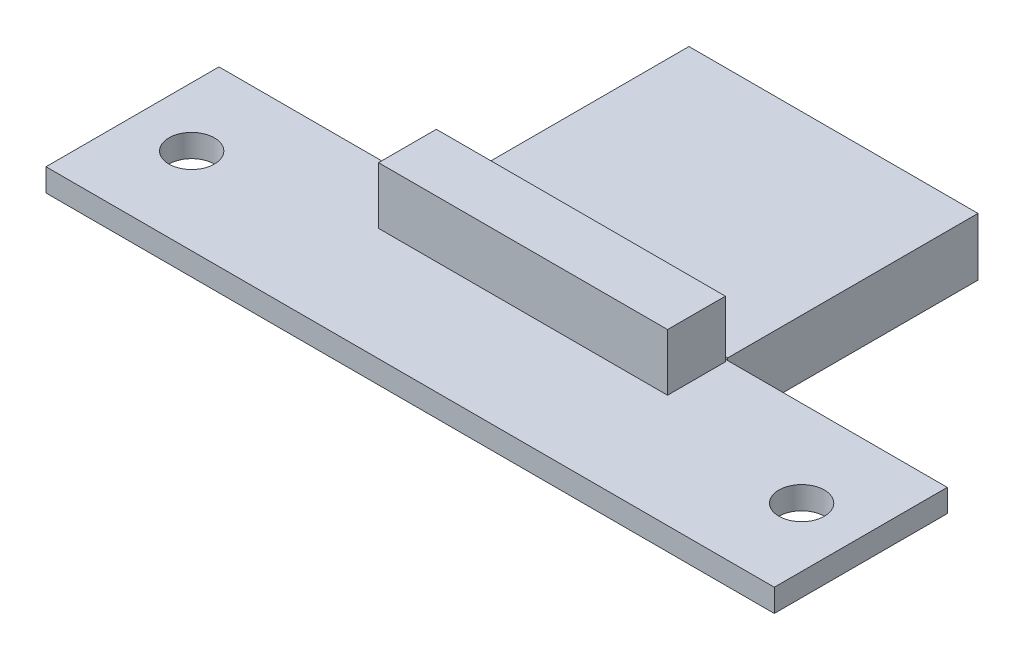
ISO-10303-21;
HEADER;
FILE_DESCRIPTION(('STEP AP214'),'2;1');
FILE_NAME('part.step','',(''),(''),'','','');
FILE_SCHEMA(('AUTOMOTIVE_DESIGN { 1 0 10303 214 1 1 1 1 }'));
ENDSEC;
DATA;
#1=APPLICATION_CONTEXT('core data for automotive mechanical design processes');
#2=APPLICATION_PROTOCOL_DEFINITION('international standard','automotive_design',2000,#1);
#3=PRODUCT_CONTEXT('',#1,'mechanical');
#4=PRODUCT('Part','Part','',(#3));
#5=PRODUCT_RELATED_PRODUCT_CATEGORY('part','',(#4));
#6=PRODUCT_DEFINITION_FORMATION('','',#4);
#7=PRODUCT_DEFINITION_CONTEXT('part definition',#1,'design');
#8=PRODUCT_DEFINITION('design','',#6,#7);
#9=PRODUCT_DEFINITION_SHAPE('','',#8);
#10=(LENGTH_UNIT() NAMED_UNIT(*) SI_UNIT(.MILLI.,.METRE.));
#11=(NAMED_UNIT(*) PLANE_ANGLE_UNIT() SI_UNIT($,.RADIAN.));
#12=(NAMED_UNIT(*) SI_UNIT($,.STERADIAN.) SOLID_ANGLE_UNIT());
#13=UNCERTAINTY_MEASURE_WITH_UNIT(LENGTH_MEASURE(1.E-05),#10,'distance_accuracy_value','');
#14=(GEOMETRIC_REPRESENTATION_CONTEXT(3) GLOBAL_UNCERTAINTY_ASSIGNED_CONTEXT((#13)) GLOBAL_UNIT_ASSIGNED_CONTEXT((#10,
#11,#12)) REPRESENTATION_CONTEXT('',''));
#15=CARTESIAN_POINT('',(0.,0.,0.));
#16=DIRECTION('',(0.,0.,1.));
#17=DIRECTION('',(1.,0.,0.));
#18=AXIS2_PLACEMENT_3D('',#15,#16,#17);
#19=CARTESIAN_POINT('',(0.,1.,0.));
#20=DIRECTION('',(0.,1.,0.));
#21=DIRECTION('',(0.,0.,1.));
#22=AXIS2_PLACEMENT_3D('',#19,#20,#21);
#23=PLANE('',#22);
#24=CARTESIAN_POINT('',(13.4,1.,0.));
#25=DIRECTION('',(0.,1.,0.));
#26=DIRECTION('',(0.,0.,1.));
#27=AXIS2_PLACEMENT_3D('',#24,#25,#26);
#28=CIRCLE('',#27,1.);
#29=CARTESIAN_POINT('',(13.4,1.,0.999999999999997));
#30=VERTEX_POINT('',#29);
#31=EDGE_CURVE('E370',#30,#30,#28,.T.);
#32=ORIENTED_EDGE('',*,*,#31,.F.);
#33=EDGE_LOOP('',(#32));
#34=FACE_BOUND('',#33,.T.);
#35=CARTESIAN_POINT('',(-13.4,1.,0.));
#36=DIRECTION('',(0.,1.,0.));
#37=DIRECTION('',(0.,0.,1.));
#38=AXIS2_PLACEMENT_3D('',#35,#36,#37);
#39=CIRCLE('',#38,1.);
#40=CARTESIAN_POINT('',(-13.4,1.,1.));
#41=VERTEX_POINT('',#40);
#42=EDGE_CURVE('E374',#41,#41,#39,.T.);
#43=ORIENTED_EDGE('',*,*,#42,.F.);
#44=EDGE_LOOP('',(#43));
#45=FACE_BOUND('',#44,.T.);
#46=DIRECTION('',(0.,0.,-1.));
#47=VECTOR('',#46,1.);
#48=CARTESIAN_POINT('',(16.,1.,-3.8));
#49=LINE('',#48,#47);
#50=CARTESIAN_POINT('',(16.,1.,3.8));
#51=VERTEX_POINT('',#50);
#52=CARTESIAN_POINT('',(16.,1.,-3.8));
#53=VERTEX_POINT('',#52);
#54=EDGE_CURVE('E383',#51,#53,#49,.T.);
#55=ORIENTED_EDGE('',*,*,#54,.T.);
#56=DIRECTION('',(-1.,0.,0.));
#57=VECTOR('',#56,1.);
#58=CARTESIAN_POINT('',(-16.,1.,-3.8));
#59=LINE('',#58,#57);
#60=CARTESIAN_POINT('',(6.35,1.,-3.8));
#61=VERTEX_POINT('',#60);
#62=EDGE_CURVE('E387',#53,#61,#59,.T.);
#63=ORIENTED_EDGE('',*,*,#62,.T.);
#64=CARTESIAN_POINT('',(-6.35,1.,-3.8));
#65=VERTEX_POINT('',#64);
#66=EDGE_CURVE('E391',#61,#65,#59,.T.);
#67=ORIENTED_EDGE('',*,*,#66,.T.);
#68=CARTESIAN_POINT('',(-16.,1.,-3.8));
#69=VERTEX_POINT('',#68);
#70=EDGE_CURVE('E62',#65,#69,#59,.T.);
#71=ORIENTED_EDGE('',*,*,#70,.T.);
#72=DIRECTION('',(0.,0.,1.));
#73=VECTOR('',#72,1.);
#74=CARTESIAN_POINT('',(-16.,1.,-3.8));
#75=LINE('',#74,#73);
#76=CARTESIAN_POINT('',(-16.,1.,3.8));
#77=VERTEX_POINT('',#76);
#78=EDGE_CURVE('E390',#69,#77,#75,.T.);
#79=ORIENTED_EDGE('',*,*,#78,.T.);
#80=DIRECTION('',(1.,0.,0.));
#81=VECTOR('',#80,1.);
#82=CARTESIAN_POINT('',(-16.,1.,3.8));
#83=LINE('',#82,#81);
#84=EDGE_CURVE('E393',#77,#51,#83,.T.);
#85=ORIENTED_EDGE('',*,*,#84,.T.);
#86=EDGE_LOOP('',(#55,#63,#67,#71,#79,#85));
#87=FACE_BOUND('',#86,.T.);
#88=DIRECTION('',(-1.,0.,0.));
#89=VECTOR('',#88,1.);
#90=CARTESIAN_POINT('',(-6.35,1.,-3.7));
#91=LINE('',#90,#89);
#92=CARTESIAN_POINT('',(6.35,1.,-3.7));
#93=VERTEX_POINT('',#92);
#94=CARTESIAN_POINT('',(-6.35,1.,-3.7));
#95=VERTEX_POINT('',#94);
#96=EDGE_CURVE('E826',#93,#95,#91,.T.);
#97=ORIENTED_EDGE('',*,*,#96,.F.);
#98=DIRECTION('',(0.,0.,-1.));
#99=VECTOR('',#98,1.);
#100=CARTESIAN_POINT('',(6.35,1.,-1.16));
#101=LINE('',#100,#99);
#102=CARTESIAN_POINT('',(6.35,1.,-1.16));
#103=VERTEX_POINT('',#102);
#104=EDGE_CURVE('E235',#103,#93,#101,.T.);
#105=ORIENTED_EDGE('',*,*,#104,.F.);
#106=DIRECTION('',(1.,0.,0.));
#107=VECTOR('',#106,1.);
#108=CARTESIAN_POINT('',(-6.35,1.,-1.16));
#109=LINE('',#108,#107);
#110=CARTESIAN_POINT('',(-6.35,1.,-1.16));
#111=VERTEX_POINT('',#110);
#112=EDGE_CURVE('E231',#111,#103,#109,.T.);
#113=ORIENTED_EDGE('',*,*,#112,.F.);
#114=DIRECTION('',(0.,0.,1.));
#115=VECTOR('',#114,1.);
#116=CARTESIAN_POINT('',(-6.35,1.,-1.16));
#117=LINE('',#116,#115);
#118=EDGE_CURVE('E823',#95,#111,#117,.T.);
#119=ORIENTED_EDGE('',*,*,#118,.F.);
#120=EDGE_LOOP('',(#97,#105,#113,#119));
#121=FACE_BOUND('',#120,.T.);
#122=ADVANCED_FACE('F35',(#34,#45,#87,#121),#23,.T.);
#123=CARTESIAN_POINT('',(-16.,1.,-3.8));
#124=DIRECTION('',(0.,0.,1.));
#125=DIRECTION('',(1.,0.,0.));
#126=AXIS2_PLACEMENT_3D('',#123,#124,#125);
#127=PLANE('',#126);
#128=DIRECTION('',(0.,1.,0.));
#129=VECTOR('',#128,1.);
#130=CARTESIAN_POINT('',(-6.35,1.1,-3.8));
#131=LINE('',#130,#129);
#132=CARTESIAN_POINT('',(-6.35,0.,-3.8));
#133=VERTEX_POINT('',#132);
#134=EDGE_CURVE('E11',#133,#65,#131,.T.);
#135=ORIENTED_EDGE('',*,*,#134,.F.);
#136=DIRECTION('',(-1.,0.,0.));
#137=VECTOR('',#136,1.);
#138=CARTESIAN_POINT('',(-16.,0.,-3.8));
#139=LINE('',#138,#137);
#140=CARTESIAN_POINT('',(-16.,0.,-3.8));
#141=VERTEX_POINT('',#140);
#142=EDGE_CURVE('E398',#133,#141,#139,.T.);
#143=ORIENTED_EDGE('',*,*,#142,.T.);
#144=DIRECTION('',(0.,-1.,0.));
#145=VECTOR('',#144,1.);
#146=CARTESIAN_POINT('',(-16.,1.,-3.8));
#147=LINE('',#146,#145);
#148=EDGE_CURVE('E409',#69,#141,#147,.T.);
#149=ORIENTED_EDGE('',*,*,#148,.F.);
#150=ORIENTED_EDGE('',*,*,#70,.F.);
#151=EDGE_LOOP('',(#135,#143,#149,#150));
#152=FACE_BOUND('',#151,.T.);
#153=ADVANCED_FACE('F450',(#152),#127,.F.);
#154=DIRECTION('',(0.,-1.,0.));
#155=VECTOR('',#154,1.);
#156=CARTESIAN_POINT('',(6.35,1.1,-3.8));
#157=LINE('',#156,#155);
#158=CARTESIAN_POINT('',(6.35,0.,-3.8));
#159=VERTEX_POINT('',#158);
#160=EDGE_CURVE('E44',#61,#159,#157,.T.);
#161=ORIENTED_EDGE('',*,*,#160,.F.);
#162=ORIENTED_EDGE('',*,*,#62,.F.);
#163=DIRECTION('',(0.,-1.,0.));
#164=VECTOR('',#163,1.);
#165=CARTESIAN_POINT('',(16.,1.,-3.8));
#166=LINE('',#165,#164);
#167=CARTESIAN_POINT('',(16.,0.,-3.8));
#168=VERTEX_POINT('',#167);
#169=EDGE_CURVE('E39',#53,#168,#166,.T.);
#170=ORIENTED_EDGE('',*,*,#169,.T.);
#171=EDGE_CURVE('E399',#168,#159,#139,.T.);
#172=ORIENTED_EDGE('',*,*,#171,.T.);
#173=EDGE_LOOP('',(#161,#162,#170,#172));
#174=FACE_BOUND('',#173,.T.);
#175=ADVANCED_FACE('F464',(#174),#127,.F.);
#176=CARTESIAN_POINT('',(0.,0.,0.));
#177=DIRECTION('',(0.,1.,0.));
#178=DIRECTION('',(0.,0.,1.));
#179=AXIS2_PLACEMENT_3D('',#176,#177,#178);
#180=PLANE('',#179);
#181=DIRECTION('',(0.,0.,1.));
#182=VECTOR('',#181,1.);
#183=CARTESIAN_POINT('',(10.3,0.,1.1));
#184=LINE('',#183,#182);
#185=CARTESIAN_POINT('',(10.3,0.,-1.1));
#186=VERTEX_POINT('',#185);
#187=CARTESIAN_POINT('',(10.3,0.,1.1));
#188=VERTEX_POINT('',#187);
#189=EDGE_CURVE('E304',#186,#188,#184,.T.);
#190=ORIENTED_EDGE('',*,*,#189,.F.);
#191=DIRECTION('',(1.,0.,0.));
#192=VECTOR('',#191,1.);
#193=CARTESIAN_POINT('',(8.7,0.,-1.1));
#194=LINE('',#193,#192);
#195=CARTESIAN_POINT('',(8.7,0.,-1.1));
#196=VERTEX_POINT('',#195);
#197=EDGE_CURVE('E309',#196,#186,#194,.T.);
#198=ORIENTED_EDGE('',*,*,#197,.F.);
#199=DIRECTION('',(0.,0.,-1.));
#200=VECTOR('',#199,1.);
#201=CARTESIAN_POINT('',(8.7,0.,1.1));
#202=LINE('',#201,#200);
#203=CARTESIAN_POINT('',(8.7,0.,1.1));
#204=VERTEX_POINT('',#203);
#205=EDGE_CURVE('E321',#204,#196,#202,.T.);
#206=ORIENTED_EDGE('',*,*,#205,.F.);
#207=DIRECTION('',(-1.,0.,0.));
#208=VECTOR('',#207,1.);
#209=CARTESIAN_POINT('',(8.7,0.,1.1));
#210=LINE('',#209,#208);
#211=EDGE_CURVE('E318',#188,#204,#210,.T.);
#212=ORIENTED_EDGE('',*,*,#211,.F.);
#213=EDGE_LOOP('',(#190,#198,#206,#212));
#214=FACE_BOUND('',#213,.T.);
#215=DIRECTION('',(0.,0.,-1.));
#216=VECTOR('',#215,1.);
#217=CARTESIAN_POINT('',(16.,0.,-3.8));
#218=LINE('',#217,#216);
#219=CARTESIAN_POINT('',(16.,0.,3.8));
#220=VERTEX_POINT('',#219);
#221=EDGE_CURVE('E380',#220,#168,#218,.T.);
#222=ORIENTED_EDGE('',*,*,#221,.F.);
#223=DIRECTION('',(1.,0.,0.));
#224=VECTOR('',#223,1.);
#225=CARTESIAN_POINT('',(-16.,0.,3.8));
#226=LINE('',#225,#224);
#227=CARTESIAN_POINT('',(-16.,0.,3.8));
#228=VERTEX_POINT('',#227);
#229=EDGE_CURVE('E386',#228,#220,#226,.T.);
#230=ORIENTED_EDGE('',*,*,#229,.F.);
#231=DIRECTION('',(0.,0.,1.));
#232=VECTOR('',#231,1.);
#233=CARTESIAN_POINT('',(-16.,0.,-3.8));
#234=LINE('',#233,#232);
#235=EDGE_CURVE('E401',#141,#228,#234,.T.);
#236=ORIENTED_EDGE('',*,*,#235,.F.);
#237=ORIENTED_EDGE('',*,*,#142,.F.);
#238=EDGE_CURVE('E402',#159,#133,#139,.T.);
#239=ORIENTED_EDGE('',*,*,#238,.F.);
#240=ORIENTED_EDGE('',*,*,#171,.F.);
#241=EDGE_LOOP('',(#222,#230,#236,#237,#239,#240));
#242=FACE_BOUND('',#241,.T.);
#243=CARTESIAN_POINT('',(-13.4,0.,0.));
#244=DIRECTION('',(0.,1.,0.));
#245=DIRECTION('',(0.,0.,1.));
#246=AXIS2_PLACEMENT_3D('',#243,#244,#245);
#247=CIRCLE('',#246,1.);
#248=CARTESIAN_POINT('',(-13.4,0.,1.));
#249=VERTEX_POINT('',#248);
#250=EDGE_CURVE('E377',#249,#249,#247,.T.);
#251=ORIENTED_EDGE('',*,*,#250,.T.);
#252=EDGE_LOOP('',(#251));
#253=FACE_BOUND('',#252,.T.);
#254=CARTESIAN_POINT('',(13.4,0.,0.));
#255=DIRECTION('',(0.,1.,0.));
#256=DIRECTION('',(0.,0.,1.));
#257=AXIS2_PLACEMENT_3D('',#254,#255,#256);
#258=CIRCLE('',#257,1.);
#259=CARTESIAN_POINT('',(13.4,0.,0.999999999999997));
#260=VERTEX_POINT('',#259);
#261=EDGE_CURVE('E371',#260,#260,#258,.T.);
#262=ORIENTED_EDGE('',*,*,#261,.T.);
#263=EDGE_LOOP('',(#262));
#264=FACE_BOUND('',#263,.T.);
#265=DIRECTION('',(0.,0.,1.));
#266=VECTOR('',#265,1.);
#267=CARTESIAN_POINT('',(-8.7,0.,1.1));
#268=LINE('',#267,#266);
#269=CARTESIAN_POINT('',(-8.7,0.,-1.1));
#270=VERTEX_POINT('',#269);
#271=CARTESIAN_POINT('',(-8.7,0.,1.1));
#272=VERTEX_POINT('',#271);
#273=EDGE_CURVE('E337',#270,#272,#268,.T.);
#274=ORIENTED_EDGE('',*,*,#273,.F.);
#275=DIRECTION('',(1.,0.,0.));
#276=VECTOR('',#275,1.);
#277=CARTESIAN_POINT('',(-10.3,0.,-1.1));
#278=LINE('',#277,#276);
#279=CARTESIAN_POINT('',(-10.3,0.,-1.1));
#280=VERTEX_POINT('',#279);
#281=EDGE_CURVE('E342',#280,#270,#278,.T.);
#282=ORIENTED_EDGE('',*,*,#281,.F.);
#283=DIRECTION('',(0.,0.,-1.));
#284=VECTOR('',#283,1.);
#285=CARTESIAN_POINT('',(-10.3,0.,1.1));
#286=LINE('',#285,#284);
#287=CARTESIAN_POINT('',(-10.3,0.,1.1));
#288=VERTEX_POINT('',#287);
#289=EDGE_CURVE('E354',#288,#280,#286,.T.);
#290=ORIENTED_EDGE('',*,*,#289,.F.);
#291=DIRECTION('',(-1.,0.,0.));
#292=VECTOR('',#291,1.);
#293=CARTESIAN_POINT('',(-10.3,0.,1.1));
#294=LINE('',#293,#292);
#295=EDGE_CURVE('E351',#272,#288,#294,.T.);
#296=ORIENTED_EDGE('',*,*,#295,.F.);
#297=EDGE_LOOP('',(#274,#282,#290,#296));
#298=FACE_BOUND('',#297,.T.);
#299=DIRECTION('',(0.,0.,1.));
#300=VECTOR('',#299,1.);
#301=CARTESIAN_POINT('',(0.8,0.,2.2));
#302=LINE('',#301,#300);
#303=CARTESIAN_POINT('',(0.800000000000001,0.,0.));
#304=VERTEX_POINT('',#303);
#305=CARTESIAN_POINT('',(0.8,0.,2.2));
#306=VERTEX_POINT('',#305);
#307=EDGE_CURVE('E271',#304,#306,#302,.T.);
#308=ORIENTED_EDGE('',*,*,#307,.F.);
#309=DIRECTION('',(1.,0.,0.));
#310=VECTOR('',#309,1.);
#311=CARTESIAN_POINT('',(-0.800000000000001,0.,0.));
#312=LINE('',#311,#310);
#313=CARTESIAN_POINT('',(-0.800000000000001,0.,0.));
#314=VERTEX_POINT('',#313);
#315=EDGE_CURVE('E276',#314,#304,#312,.T.);
#316=ORIENTED_EDGE('',*,*,#315,.F.);
#317=DIRECTION('',(0.,0.,-1.));
#318=VECTOR('',#317,1.);
#319=CARTESIAN_POINT('',(-0.8,0.,2.2));
#320=LINE('',#319,#318);
#321=CARTESIAN_POINT('',(-0.8,0.,2.2));
#322=VERTEX_POINT('',#321);
#323=EDGE_CURVE('E288',#322,#314,#320,.T.);
#324=ORIENTED_EDGE('',*,*,#323,.F.);
#325=DIRECTION('',(-1.,0.,0.));
#326=VECTOR('',#325,1.);
#327=CARTESIAN_POINT('',(-0.8,0.,2.2));
#328=LINE('',#327,#326);
#329=EDGE_CURVE('E285',#306,#322,#328,.T.);
#330=ORIENTED_EDGE('',*,*,#329,.F.);
#331=EDGE_LOOP('',(#308,#316,#324,#330));
#332=FACE_BOUND('',#331,.T.);
#333=ADVANCED_FACE('F462',(#214,#242,#253,#264,#298,#332),#180,.F.);
#334=CARTESIAN_POINT('',(16.,1.,-3.8));
#335=DIRECTION('',(-1.,0.,0.));
#336=DIRECTION('',(0.,0.,1.));
#337=AXIS2_PLACEMENT_3D('',#334,#335,#336);
#338=PLANE('',#337);
#339=ORIENTED_EDGE('',*,*,#221,.T.);
#340=ORIENTED_EDGE('',*,*,#169,.F.);
#341=ORIENTED_EDGE('',*,*,#54,.F.);
#342=DIRECTION('',(0.,-1.,0.));
#343=VECTOR('',#342,1.);
#344=CARTESIAN_POINT('',(16.,1.,3.8));
#345=LINE('',#344,#343);
#346=EDGE_CURVE('E395',#51,#220,#345,.T.);
#347=ORIENTED_EDGE('',*,*,#346,.T.);
#348=EDGE_LOOP('',(#339,#340,#341,#347));
#349=FACE_BOUND('',#348,.T.);
#350=ADVANCED_FACE('F37',(#349),#338,.F.);
#351=CARTESIAN_POINT('',(-16.,1.,-3.8));
#352=DIRECTION('',(1.,0.,0.));
#353=DIRECTION('',(0.,0.,-1.));
#354=AXIS2_PLACEMENT_3D('',#351,#352,#353);
#355=PLANE('',#354);
#356=ORIENTED_EDGE('',*,*,#235,.T.);
#357=DIRECTION('',(0.,-1.,0.));
#358=VECTOR('',#357,1.);
#359=CARTESIAN_POINT('',(-16.,1.,3.8));
#360=LINE('',#359,#358);
#361=EDGE_CURVE('E407',#77,#228,#360,.T.);
#362=ORIENTED_EDGE('',*,*,#361,.F.);
#363=ORIENTED_EDGE('',*,*,#78,.F.);
#364=ORIENTED_EDGE('',*,*,#148,.T.);
#365=EDGE_LOOP('',(#356,#362,#363,#364));
#366=FACE_BOUND('',#365,.T.);
#367=ADVANCED_FACE('F452',(#366),#355,.F.);
#368=CARTESIAN_POINT('',(-16.,1.,3.8));
#369=DIRECTION('',(0.,0.,-1.));
#370=DIRECTION('',(-1.,0.,0.));
#371=AXIS2_PLACEMENT_3D('',#368,#369,#370);
#372=PLANE('',#371);
#373=ORIENTED_EDGE('',*,*,#229,.T.);
#374=ORIENTED_EDGE('',*,*,#346,.F.);
#375=ORIENTED_EDGE('',*,*,#84,.F.);
#376=ORIENTED_EDGE('',*,*,#361,.T.);
#377=EDGE_LOOP('',(#373,#374,#375,#376));
#378=FACE_BOUND('',#377,.T.);
#379=ADVANCED_FACE('F457',(#378),#372,.F.);
#380=CARTESIAN_POINT('',(-13.4,0.,0.));
#381=DIRECTION('',(0.,1.,0.));
#382=DIRECTION('',(0.,0.,1.));
#383=AXIS2_PLACEMENT_3D('',#380,#381,#382);
#384=CYLINDRICAL_SURFACE('',#383,1.);
#385=ORIENTED_EDGE('',*,*,#250,.F.);
#386=EDGE_LOOP('',(#385));
#387=FACE_BOUND('',#386,.T.);
#388=ORIENTED_EDGE('',*,*,#42,.T.);
#389=EDGE_LOOP('',(#388));
#390=FACE_BOUND('',#389,.T.);
#391=ADVANCED_FACE('F481',(#387,#390),#384,.F.);
#392=CARTESIAN_POINT('',(13.4,0.,0.));
#393=DIRECTION('',(0.,1.,0.));
#394=DIRECTION('',(0.,0.,1.));
#395=AXIS2_PLACEMENT_3D('',#392,#393,#394);
#396=CYLINDRICAL_SURFACE('',#395,1.);
#397=ORIENTED_EDGE('',*,*,#261,.F.);
#398=EDGE_LOOP('',(#397));
#399=FACE_BOUND('',#398,.T.);
#400=ORIENTED_EDGE('',*,*,#31,.T.);
#401=EDGE_LOOP('',(#400));
#402=FACE_BOUND('',#401,.T.);
#403=ADVANCED_FACE('F667',(#399,#402),#396,.F.);
#404=CARTESIAN_POINT('',(-8.7,-1.,1.1));
#405=DIRECTION('',(-1.,0.,0.));
#406=DIRECTION('',(0.,0.,1.));
#407=AXIS2_PLACEMENT_3D('',#404,#405,#406);
#408=PLANE('',#407);
#409=ORIENTED_EDGE('',*,*,#273,.T.);
#410=DIRECTION('',(0.,1.,0.));
#411=VECTOR('',#410,1.);
#412=CARTESIAN_POINT('',(-8.7,-1.,1.1));
#413=LINE('',#412,#411);
#414=CARTESIAN_POINT('',(-8.7,-1.,1.1));
#415=VERTEX_POINT('',#414);
#416=EDGE_CURVE('E367',#415,#272,#413,.T.);
#417=ORIENTED_EDGE('',*,*,#416,.F.);
#418=DIRECTION('',(0.,0.,1.));
#419=VECTOR('',#418,1.);
#420=CARTESIAN_POINT('',(-8.7,-1.,1.1));
#421=LINE('',#420,#419);
#422=CARTESIAN_POINT('',(-8.7,-1.,-1.1));
#423=VERTEX_POINT('',#422);
#424=EDGE_CURVE('E338',#423,#415,#421,.T.);
#425=ORIENTED_EDGE('',*,*,#424,.F.);
#426=DIRECTION('',(0.,1.,0.));
#427=VECTOR('',#426,1.);
#428=CARTESIAN_POINT('',(-8.7,-1.,-1.1));
#429=LINE('',#428,#427);
#430=EDGE_CURVE('E348',#423,#270,#429,.T.);
#431=ORIENTED_EDGE('',*,*,#430,.T.);
#432=EDGE_LOOP('',(#409,#417,#425,#431));
#433=FACE_BOUND('',#432,.T.);
#434=ADVANCED_FACE('F664',(#433),#408,.F.);
#435=CARTESIAN_POINT('',(-10.3,-1.,1.1));
#436=DIRECTION('',(0.,0.,-1.));
#437=DIRECTION('',(-1.,0.,0.));
#438=AXIS2_PLACEMENT_3D('',#435,#436,#437);
#439=PLANE('',#438);
#440=ORIENTED_EDGE('',*,*,#295,.T.);
#441=DIRECTION('',(0.,1.,0.));
#442=VECTOR('',#441,1.);
#443=CARTESIAN_POINT('',(-10.3,-1.,1.1));
#444=LINE('',#443,#442);
#445=CARTESIAN_POINT('',(-10.3,-1.,1.1));
#446=VERTEX_POINT('',#445);
#447=EDGE_CURVE('E364',#446,#288,#444,.T.);
#448=ORIENTED_EDGE('',*,*,#447,.F.);
#449=DIRECTION('',(-1.,0.,0.));
#450=VECTOR('',#449,1.);
#451=CARTESIAN_POINT('',(-10.3,-1.,1.1));
#452=LINE('',#451,#450);
#453=EDGE_CURVE('E341',#415,#446,#452,.T.);
#454=ORIENTED_EDGE('',*,*,#453,.F.);
#455=ORIENTED_EDGE('',*,*,#416,.T.);
#456=EDGE_LOOP('',(#440,#448,#454,#455));
#457=FACE_BOUND('',#456,.T.);
#458=ADVANCED_FACE('F660',(#457),#439,.F.);
#459=CARTESIAN_POINT('',(-10.3,-1.,1.1));
#460=DIRECTION('',(1.,0.,0.));
#461=DIRECTION('',(0.,0.,-1.));
#462=AXIS2_PLACEMENT_3D('',#459,#460,#461);
#463=PLANE('',#462);
#464=ORIENTED_EDGE('',*,*,#289,.T.);
#465=DIRECTION('',(0.,1.,0.));
#466=VECTOR('',#465,1.);
#467=CARTESIAN_POINT('',(-10.3,-1.,-1.1));
#468=LINE('',#467,#466);
#469=CARTESIAN_POINT('',(-10.3,-1.,-1.1));
#470=VERTEX_POINT('',#469);
#471=EDGE_CURVE('E361',#470,#280,#468,.T.);
#472=ORIENTED_EDGE('',*,*,#471,.F.);
#473=DIRECTION('',(0.,0.,-1.));
#474=VECTOR('',#473,1.);
#475=CARTESIAN_POINT('',(-10.3,-1.,1.1));
#476=LINE('',#475,#474);
#477=EDGE_CURVE('E344',#446,#470,#476,.T.);
#478=ORIENTED_EDGE('',*,*,#477,.F.);
#479=ORIENTED_EDGE('',*,*,#447,.T.);
#480=EDGE_LOOP('',(#464,#472,#478,#479));
#481=FACE_BOUND('',#480,.T.);
#482=ADVANCED_FACE('F656',(#481),#463,.F.);
#483=CARTESIAN_POINT('',(-10.3,-1.,-1.1));
#484=DIRECTION('',(0.,0.,1.));
#485=DIRECTION('',(1.,0.,0.));
#486=AXIS2_PLACEMENT_3D('',#483,#484,#485);
#487=PLANE('',#486);
#488=ORIENTED_EDGE('',*,*,#281,.T.);
#489=ORIENTED_EDGE('',*,*,#430,.F.);
#490=DIRECTION('',(1.,0.,0.));
#491=VECTOR('',#490,1.);
#492=CARTESIAN_POINT('',(-10.3,-1.,-1.1));
#493=LINE('',#492,#491);
#494=EDGE_CURVE('E346',#470,#423,#493,.T.);
#495=ORIENTED_EDGE('',*,*,#494,.F.);
#496=ORIENTED_EDGE('',*,*,#471,.T.);
#497=EDGE_LOOP('',(#488,#489,#495,#496));
#498=FACE_BOUND('',#497,.T.);
#499=ADVANCED_FACE('F652',(#498),#487,.F.);
#500=CARTESIAN_POINT('',(0.,-1.,0.));
#501=DIRECTION('',(0.,-1.,0.));
#502=DIRECTION('',(0.,0.,-1.));
#503=AXIS2_PLACEMENT_3D('',#500,#501,#502);
#504=PLANE('',#503);
#505=ORIENTED_EDGE('',*,*,#424,.T.);
#506=ORIENTED_EDGE('',*,*,#453,.T.);
#507=ORIENTED_EDGE('',*,*,#477,.T.);
#508=ORIENTED_EDGE('',*,*,#494,.T.);
#509=EDGE_LOOP('',(#505,#506,#507,#508));
#510=FACE_BOUND('',#509,.T.);
#511=ADVANCED_FACE('F648',(#510),#504,.T.);
#512=CARTESIAN_POINT('',(10.3,-1.,1.1));
#513=DIRECTION('',(-1.,0.,0.));
#514=DIRECTION('',(0.,0.,1.));
#515=AXIS2_PLACEMENT_3D('',#512,#513,#514);
#516=PLANE('',#515);
#517=ORIENTED_EDGE('',*,*,#189,.T.);
#518=DIRECTION('',(0.,1.,0.));
#519=VECTOR('',#518,1.);
#520=CARTESIAN_POINT('',(10.3,-1.,1.1));
#521=LINE('',#520,#519);
#522=CARTESIAN_POINT('',(10.3,-1.,1.1));
#523=VERTEX_POINT('',#522);
#524=EDGE_CURVE('E334',#523,#188,#521,.T.);
#525=ORIENTED_EDGE('',*,*,#524,.F.);
#526=DIRECTION('',(0.,0.,1.));
#527=VECTOR('',#526,1.);
#528=CARTESIAN_POINT('',(10.3,-1.,1.1));
#529=LINE('',#528,#527);
#530=CARTESIAN_POINT('',(10.3,-1.,-1.1));
#531=VERTEX_POINT('',#530);
#532=EDGE_CURVE('E305',#531,#523,#529,.T.);
#533=ORIENTED_EDGE('',*,*,#532,.F.);
#534=DIRECTION('',(0.,1.,0.));
#535=VECTOR('',#534,1.);
#536=CARTESIAN_POINT('',(10.3,-1.,-1.1));
#537=LINE('',#536,#535);
#538=EDGE_CURVE('E315',#531,#186,#537,.T.);
#539=ORIENTED_EDGE('',*,*,#538,.T.);
#540=EDGE_LOOP('',(#517,#525,#533,#539));
#541=FACE_BOUND('',#540,.T.);
#542=ADVANCED_FACE('F644',(#541),#516,.F.);
#543=CARTESIAN_POINT('',(8.7,-1.,1.1));
#544=DIRECTION('',(0.,0.,-1.));
#545=DIRECTION('',(-1.,0.,0.));
#546=AXIS2_PLACEMENT_3D('',#543,#544,#545);
#547=PLANE('',#546);
#548=ORIENTED_EDGE('',*,*,#211,.T.);
#549=DIRECTION('',(0.,1.,0.));
#550=VECTOR('',#549,1.);
#551=CARTESIAN_POINT('',(8.7,-1.,1.1));
#552=LINE('',#551,#550);
#553=CARTESIAN_POINT('',(8.7,-1.,1.1));
#554=VERTEX_POINT('',#553);
#555=EDGE_CURVE('E331',#554,#204,#552,.T.);
#556=ORIENTED_EDGE('',*,*,#555,.F.);
#557=DIRECTION('',(-1.,0.,0.));
#558=VECTOR('',#557,1.);
#559=CARTESIAN_POINT('',(8.7,-1.,1.1));
#560=LINE('',#559,#558);
#561=EDGE_CURVE('E308',#523,#554,#560,.T.);
#562=ORIENTED_EDGE('',*,*,#561,.F.);
#563=ORIENTED_EDGE('',*,*,#524,.T.);
#564=EDGE_LOOP('',(#548,#556,#562,#563));
#565=FACE_BOUND('',#564,.T.);
#566=ADVANCED_FACE('F640',(#565),#547,.F.);
#567=CARTESIAN_POINT('',(8.7,-1.,1.1));
#568=DIRECTION('',(1.,0.,0.));
#569=DIRECTION('',(0.,0.,-1.));
#570=AXIS2_PLACEMENT_3D('',#567,#568,#569);
#571=PLANE('',#570);
#572=ORIENTED_EDGE('',*,*,#205,.T.);
#573=DIRECTION('',(0.,1.,0.));
#574=VECTOR('',#573,1.);
#575=CARTESIAN_POINT('',(8.7,-1.,-1.1));
#576=LINE('',#575,#574);
#577=CARTESIAN_POINT('',(8.7,-1.,-1.1));
#578=VERTEX_POINT('',#577);
#579=EDGE_CURVE('E328',#578,#196,#576,.T.);
#580=ORIENTED_EDGE('',*,*,#579,.F.);
#581=DIRECTION('',(0.,0.,-1.));
#582=VECTOR('',#581,1.);
#583=CARTESIAN_POINT('',(8.7,-1.,1.1));
#584=LINE('',#583,#582);
#585=EDGE_CURVE('E311',#554,#578,#584,.T.);
#586=ORIENTED_EDGE('',*,*,#585,.F.);
#587=ORIENTED_EDGE('',*,*,#555,.T.);
#588=EDGE_LOOP('',(#572,#580,#586,#587));
#589=FACE_BOUND('',#588,.T.);
#590=ADVANCED_FACE('F636',(#589),#571,.F.);
#591=CARTESIAN_POINT('',(8.7,-1.,-1.1));
#592=DIRECTION('',(0.,0.,1.));
#593=DIRECTION('',(1.,0.,0.));
#594=AXIS2_PLACEMENT_3D('',#591,#592,#593);
#595=PLANE('',#594);
#596=ORIENTED_EDGE('',*,*,#197,.T.);
#597=ORIENTED_EDGE('',*,*,#538,.F.);
#598=DIRECTION('',(1.,0.,0.));
#599=VECTOR('',#598,1.);
#600=CARTESIAN_POINT('',(8.7,-1.,-1.1));
#601=LINE('',#600,#599);
#602=EDGE_CURVE('E313',#578,#531,#601,.T.);
#603=ORIENTED_EDGE('',*,*,#602,.F.);
#604=ORIENTED_EDGE('',*,*,#579,.T.);
#605=EDGE_LOOP('',(#596,#597,#603,#604));
#606=FACE_BOUND('',#605,.T.);
#607=ADVANCED_FACE('F632',(#606),#595,.F.);
#608=CARTESIAN_POINT('',(0.,-1.,0.));
#609=DIRECTION('',(0.,-1.,0.));
#610=DIRECTION('',(0.,0.,-1.));
#611=AXIS2_PLACEMENT_3D('',#608,#609,#610);
#612=PLANE('',#611);
#613=ORIENTED_EDGE('',*,*,#532,.T.);
#614=ORIENTED_EDGE('',*,*,#561,.T.);
#615=ORIENTED_EDGE('',*,*,#585,.T.);
#616=ORIENTED_EDGE('',*,*,#602,.T.);
#617=EDGE_LOOP('',(#613,#614,#615,#616));
#618=FACE_BOUND('',#617,.T.);
#619=ADVANCED_FACE('F628',(#618),#612,.T.);
#620=CARTESIAN_POINT('',(0.8,-1.,2.2));
#621=DIRECTION('',(-1.,0.,0.));
#622=DIRECTION('',(0.,0.,1.));
#623=AXIS2_PLACEMENT_3D('',#620,#621,#622);
#624=PLANE('',#623);
#625=ORIENTED_EDGE('',*,*,#307,.T.);
#626=DIRECTION('',(0.,1.,0.));
#627=VECTOR('',#626,1.);
#628=CARTESIAN_POINT('',(0.8,-1.,2.2));
#629=LINE('',#628,#627);
#630=CARTESIAN_POINT('',(0.8,-1.,2.2));
#631=VERTEX_POINT('',#630);
#632=EDGE_CURVE('E301',#631,#306,#629,.T.);
#633=ORIENTED_EDGE('',*,*,#632,.F.);
#634=DIRECTION('',(0.,0.,1.));
#635=VECTOR('',#634,1.);
#636=CARTESIAN_POINT('',(0.8,-1.,2.2));
#637=LINE('',#636,#635);
#638=CARTESIAN_POINT('',(0.800000000000001,-1.,0.));
#639=VERTEX_POINT('',#638);
#640=EDGE_CURVE('E272',#639,#631,#637,.T.);
#641=ORIENTED_EDGE('',*,*,#640,.F.);
#642=DIRECTION('',(0.,1.,0.));
#643=VECTOR('',#642,1.);
#644=CARTESIAN_POINT('',(0.800000000000001,-1.,0.));
#645=LINE('',#644,#643);
#646=EDGE_CURVE('E282',#639,#304,#645,.T.);
#647=ORIENTED_EDGE('',*,*,#646,.T.);
#648=EDGE_LOOP('',(#625,#633,#641,#647));
#649=FACE_BOUND('',#648,.T.);
#650=ADVANCED_FACE('F624',(#649),#624,.F.);
#651=CARTESIAN_POINT('',(-0.8,-1.,2.2));
#652=DIRECTION('',(0.,0.,-1.));
#653=DIRECTION('',(-1.,0.,0.));
#654=AXIS2_PLACEMENT_3D('',#651,#652,#653);
#655=PLANE('',#654);
#656=ORIENTED_EDGE('',*,*,#329,.T.);
#657=DIRECTION('',(0.,1.,0.));
#658=VECTOR('',#657,1.);
#659=CARTESIAN_POINT('',(-0.8,-1.,2.2));
#660=LINE('',#659,#658);
#661=CARTESIAN_POINT('',(-0.8,-1.,2.2));
#662=VERTEX_POINT('',#661);
#663=EDGE_CURVE('E298',#662,#322,#660,.T.);
#664=ORIENTED_EDGE('',*,*,#663,.F.);
#665=DIRECTION('',(-1.,0.,0.));
#666=VECTOR('',#665,1.);
#667=CARTESIAN_POINT('',(-0.8,-1.,2.2));
#668=LINE('',#667,#666);
#669=EDGE_CURVE('E275',#631,#662,#668,.T.);
#670=ORIENTED_EDGE('',*,*,#669,.F.);
#671=ORIENTED_EDGE('',*,*,#632,.T.);
#672=EDGE_LOOP('',(#656,#664,#670,#671));
#673=FACE_BOUND('',#672,.T.);
#674=ADVANCED_FACE('F620',(#673),#655,.F.);
#675=CARTESIAN_POINT('',(-0.8,-1.,2.2));
#676=DIRECTION('',(1.,0.,0.));
#677=DIRECTION('',(0.,0.,-1.));
#678=AXIS2_PLACEMENT_3D('',#675,#676,#677);
#679=PLANE('',#678);
#680=ORIENTED_EDGE('',*,*,#323,.T.);
#681=DIRECTION('',(0.,1.,0.));
#682=VECTOR('',#681,1.);
#683=CARTESIAN_POINT('',(-0.800000000000001,-1.,0.));
#684=LINE('',#683,#682);
#685=CARTESIAN_POINT('',(-0.800000000000001,-1.,0.));
#686=VERTEX_POINT('',#685);
#687=EDGE_CURVE('E295',#686,#314,#684,.T.);
#688=ORIENTED_EDGE('',*,*,#687,.F.);
#689=DIRECTION('',(0.,0.,-1.));
#690=VECTOR('',#689,1.);
#691=CARTESIAN_POINT('',(-0.8,-1.,2.2));
#692=LINE('',#691,#690);
#693=EDGE_CURVE('E278',#662,#686,#692,.T.);
#694=ORIENTED_EDGE('',*,*,#693,.F.);
#695=ORIENTED_EDGE('',*,*,#663,.T.);
#696=EDGE_LOOP('',(#680,#688,#694,#695));
#697=FACE_BOUND('',#696,.T.);
#698=ADVANCED_FACE('F616',(#697),#679,.F.);
#699=CARTESIAN_POINT('',(-0.800000000000001,-1.,0.));
#700=DIRECTION('',(0.,0.,1.));
#701=DIRECTION('',(1.,0.,0.));
#702=AXIS2_PLACEMENT_3D('',#699,#700,#701);
#703=PLANE('',#702);
#704=ORIENTED_EDGE('',*,*,#315,.T.);
#705=ORIENTED_EDGE('',*,*,#646,.F.);
#706=DIRECTION('',(1.,0.,0.));
#707=VECTOR('',#706,1.);
#708=CARTESIAN_POINT('',(-0.800000000000001,-1.,0.));
#709=LINE('',#708,#707);
#710=EDGE_CURVE('E280',#686,#639,#709,.T.);
#711=ORIENTED_EDGE('',*,*,#710,.F.);
#712=ORIENTED_EDGE('',*,*,#687,.T.);
#713=EDGE_LOOP('',(#704,#705,#711,#712));
#714=FACE_BOUND('',#713,.T.);
#715=ADVANCED_FACE('F612',(#714),#703,.F.);
#716=CARTESIAN_POINT('',(0.,-1.,0.));
#717=DIRECTION('',(0.,-1.,0.));
#718=DIRECTION('',(0.,0.,-1.));
#719=AXIS2_PLACEMENT_3D('',#716,#717,#718);
#720=PLANE('',#719);
#721=ORIENTED_EDGE('',*,*,#640,.T.);
#722=ORIENTED_EDGE('',*,*,#669,.T.);
#723=ORIENTED_EDGE('',*,*,#693,.T.);
#724=ORIENTED_EDGE('',*,*,#710,.T.);
#725=EDGE_LOOP('',(#721,#722,#723,#724));
#726=FACE_BOUND('',#725,.T.);
#727=ADVANCED_FACE('F509',(#726),#720,.T.);
#728=CARTESIAN_POINT('',(0.,0.,-3.8));
#729=DIRECTION('',(0.,0.,-1.));
#730=DIRECTION('',(-1.,0.,0.));
#731=AXIS2_PLACEMENT_3D('',#728,#729,#730);
#732=PLANE('',#731);
#733=CARTESIAN_POINT('',(6.35,-1.44,-3.8));
#734=VERTEX_POINT('',#733);
#735=EDGE_CURVE('E255',#159,#734,#157,.T.);
#736=ORIENTED_EDGE('',*,*,#735,.F.);
#737=ORIENTED_EDGE('',*,*,#238,.T.);
#738=CARTESIAN_POINT('',(-6.35,-1.44,-3.8));
#739=VERTEX_POINT('',#738);
#740=EDGE_CURVE('E46',#739,#133,#131,.T.);
#741=ORIENTED_EDGE('',*,*,#740,.F.);
#742=DIRECTION('',(-1.,0.,0.));
#743=VECTOR('',#742,1.);
#744=CARTESIAN_POINT('',(6.35,-1.44,-3.8));
#745=LINE('',#744,#743);
#746=EDGE_CURVE('E245',#734,#739,#745,.T.);
#747=ORIENTED_EDGE('',*,*,#746,.F.);
#748=EDGE_LOOP('',(#736,#737,#741,#747));
#749=FACE_BOUND('',#748,.T.);
#750=ADVANCED_FACE('F431',(#749),#732,.F.);
#751=CARTESIAN_POINT('',(-6.35,1.1,-14.8));
#752=DIRECTION('',(1.,0.,0.));
#753=DIRECTION('',(0.,0.,-1.));
#754=AXIS2_PLACEMENT_3D('',#751,#752,#753);
#755=PLANE('',#754);
#756=ORIENTED_EDGE('',*,*,#740,.T.);
#757=ORIENTED_EDGE('',*,*,#134,.T.);
#758=CARTESIAN_POINT('',(-6.35,1.1,-3.8));
#759=VERTEX_POINT('',#758);
#760=EDGE_CURVE('E47',#65,#759,#131,.T.);
#761=ORIENTED_EDGE('',*,*,#760,.T.);
#762=DIRECTION('',(0.,0.,1.));
#763=VECTOR('',#762,1.);
#764=CARTESIAN_POINT('',(-6.35,1.1,-14.8));
#765=LINE('',#764,#763);
#766=CARTESIAN_POINT('',(-6.35,1.1,-14.8));
#767=VERTEX_POINT('',#766);
#768=EDGE_CURVE('E268',#767,#759,#765,.T.);
#769=ORIENTED_EDGE('',*,*,#768,.F.);
#770=DIRECTION('',(0.,1.,0.));
#771=VECTOR('',#770,1.);
#772=CARTESIAN_POINT('',(-6.35,1.1,-14.8));
#773=LINE('',#772,#771);
#774=CARTESIAN_POINT('',(-6.35,-1.44,-14.8));
#775=VERTEX_POINT('',#774);
#776=EDGE_CURVE('E241',#775,#767,#773,.T.);
#777=ORIENTED_EDGE('',*,*,#776,.F.);
#778=DIRECTION('',(0.,0.,1.));
#779=VECTOR('',#778,1.);
#780=CARTESIAN_POINT('',(-6.35,-1.44,-14.8));
#781=LINE('',#780,#779);
#782=EDGE_CURVE('E250',#775,#739,#781,.T.);
#783=ORIENTED_EDGE('',*,*,#782,.T.);
#784=EDGE_LOOP('',(#756,#757,#761,#769,#777,#783));
#785=FACE_BOUND('',#784,.T.);
#786=ADVANCED_FACE('F434',(#785),#755,.F.);
#787=CARTESIAN_POINT('',(6.35,1.1,-14.8));
#788=DIRECTION('',(0.,-1.,0.));
#789=DIRECTION('',(0.,0.,-1.));
#790=AXIS2_PLACEMENT_3D('',#787,#788,#789);
#791=PLANE('',#790);
#792=DIRECTION('',(1.,0.,0.));
#793=VECTOR('',#792,1.);
#794=CARTESIAN_POINT('',(6.35,1.1,-3.8));
#795=LINE('',#794,#793);
#796=CARTESIAN_POINT('',(6.35,1.1,-3.8));
#797=VERTEX_POINT('',#796);
#798=EDGE_CURVE('E253',#759,#797,#795,.T.);
#799=ORIENTED_EDGE('',*,*,#798,.T.);
#800=DIRECTION('',(0.,0.,1.));
#801=VECTOR('',#800,1.);
#802=CARTESIAN_POINT('',(6.35,1.1,-14.8));
#803=LINE('',#802,#801);
#804=CARTESIAN_POINT('',(6.35,1.1,-14.8));
#805=VERTEX_POINT('',#804);
#806=EDGE_CURVE('E265',#805,#797,#803,.T.);
#807=ORIENTED_EDGE('',*,*,#806,.F.);
#808=DIRECTION('',(1.,0.,0.));
#809=VECTOR('',#808,1.);
#810=CARTESIAN_POINT('',(6.35,1.1,-14.8));
#811=LINE('',#810,#809);
#812=EDGE_CURVE('E244',#767,#805,#811,.T.);
#813=ORIENTED_EDGE('',*,*,#812,.F.);
#814=ORIENTED_EDGE('',*,*,#768,.T.);
#815=EDGE_LOOP('',(#799,#807,#813,#814));
#816=FACE_BOUND('',#815,.T.);
#817=ADVANCED_FACE('F520',(#816),#791,.F.);
#818=CARTESIAN_POINT('',(6.35,1.1,-14.8));
#819=DIRECTION('',(-1.,0.,0.));
#820=DIRECTION('',(0.,0.,1.));
#821=AXIS2_PLACEMENT_3D('',#818,#819,#820);
#822=PLANE('',#821);
#823=EDGE_CURVE('E256',#797,#61,#157,.T.);
#824=ORIENTED_EDGE('',*,*,#823,.T.);
#825=ORIENTED_EDGE('',*,*,#160,.T.);
#826=ORIENTED_EDGE('',*,*,#735,.T.);
#827=DIRECTION('',(0.,0.,1.));
#828=VECTOR('',#827,1.);
#829=CARTESIAN_POINT('',(6.35,-1.44,-14.8));
#830=LINE('',#829,#828);
#831=CARTESIAN_POINT('',(6.35,-1.44,-14.8));
#832=VERTEX_POINT('',#831);
#833=EDGE_CURVE('E262',#832,#734,#830,.T.);
#834=ORIENTED_EDGE('',*,*,#833,.F.);
#835=DIRECTION('',(0.,-1.,0.));
#836=VECTOR('',#835,1.);
#837=CARTESIAN_POINT('',(6.35,1.1,-14.8));
#838=LINE('',#837,#836);
#839=EDGE_CURVE('E247',#805,#832,#838,.T.);
#840=ORIENTED_EDGE('',*,*,#839,.F.);
#841=ORIENTED_EDGE('',*,*,#806,.T.);
#842=EDGE_LOOP('',(#824,#825,#826,#834,#840,#841));
#843=FACE_BOUND('',#842,.T.);
#844=ADVANCED_FACE('F421',(#843),#822,.F.);
#845=CARTESIAN_POINT('',(6.35,-1.44,-14.8));
#846=DIRECTION('',(0.,1.,0.));
#847=DIRECTION('',(-1.,0.,0.));
#848=AXIS2_PLACEMENT_3D('',#845,#846,#847);
#849=PLANE('',#848);
#850=ORIENTED_EDGE('',*,*,#746,.T.);
#851=ORIENTED_EDGE('',*,*,#782,.F.);
#852=DIRECTION('',(-1.,0.,0.));
#853=VECTOR('',#852,1.);
#854=CARTESIAN_POINT('',(6.35,-1.44,-14.8));
#855=LINE('',#854,#853);
#856=EDGE_CURVE('E249',#832,#775,#855,.T.);
#857=ORIENTED_EDGE('',*,*,#856,.F.);
#858=ORIENTED_EDGE('',*,*,#833,.T.);
#859=EDGE_LOOP('',(#850,#851,#857,#858));
#860=FACE_BOUND('',#859,.T.);
#861=ADVANCED_FACE('F428',(#860),#849,.F.);
#862=CARTESIAN_POINT('',(0.,0.,-14.8));
#863=DIRECTION('',(0.,0.,-1.));
#864=DIRECTION('',(-1.,0.,0.));
#865=AXIS2_PLACEMENT_3D('',#862,#863,#864);
#866=PLANE('',#865);
#867=ORIENTED_EDGE('',*,*,#776,.T.);
#868=ORIENTED_EDGE('',*,*,#812,.T.);
#869=ORIENTED_EDGE('',*,*,#839,.T.);
#870=ORIENTED_EDGE('',*,*,#856,.T.);
#871=EDGE_LOOP('',(#867,#868,#869,#870));
#872=FACE_BOUND('',#871,.T.);
#873=ADVANCED_FACE('F438',(#872),#866,.T.);
#874=ORIENTED_EDGE('',*,*,#66,.F.);
#875=ORIENTED_EDGE('',*,*,#823,.F.);
#876=ORIENTED_EDGE('',*,*,#798,.F.);
#877=ORIENTED_EDGE('',*,*,#760,.F.);
#878=EDGE_LOOP('',(#874,#875,#876,#877));
#879=FACE_BOUND('',#878,.T.);
#880=ADVANCED_FACE('F445',(#879),#732,.F.);
#881=CARTESIAN_POINT('',(6.35,3.5,-1.16));
#882=DIRECTION('',(-1.,0.,0.));
#883=DIRECTION('',(0.,0.,1.));
#884=AXIS2_PLACEMENT_3D('',#881,#882,#883);
#885=PLANE('',#884);
#886=ORIENTED_EDGE('',*,*,#104,.T.);
#887=DIRECTION('',(0.,-1.,0.));
#888=VECTOR('',#887,1.);
#889=CARTESIAN_POINT('',(6.35,3.5,-3.7));
#890=LINE('',#889,#888);
#891=CARTESIAN_POINT('',(6.35,3.5,-3.7));
#892=VERTEX_POINT('',#891);
#893=EDGE_CURVE('E216',#892,#93,#890,.T.);
#894=ORIENTED_EDGE('',*,*,#893,.F.);
#895=DIRECTION('',(0.,0.,-1.));
#896=VECTOR('',#895,1.);
#897=CARTESIAN_POINT('',(6.35,3.5,-1.16));
#898=LINE('',#897,#896);
#899=CARTESIAN_POINT('',(6.35,3.5,-1.16));
#900=VERTEX_POINT('',#899);
#901=EDGE_CURVE('E223',#900,#892,#898,.T.);
#902=ORIENTED_EDGE('',*,*,#901,.F.);
#903=DIRECTION('',(0.,-1.,0.));
#904=VECTOR('',#903,1.);
#905=CARTESIAN_POINT('',(6.35,3.5,-1.16));
#906=LINE('',#905,#904);
#907=EDGE_CURVE('E821',#900,#103,#906,.T.);
#908=ORIENTED_EDGE('',*,*,#907,.T.);
#909=EDGE_LOOP('',(#886,#894,#902,#908));
#910=FACE_BOUND('',#909,.T.);
#911=ADVANCED_FACE('F233',(#910),#885,.F.);
#912=CARTESIAN_POINT('',(-6.35,3.5,-3.7));
#913=DIRECTION('',(0.,0.,1.));
#914=DIRECTION('',(1.,0.,0.));
#915=AXIS2_PLACEMENT_3D('',#912,#913,#914);
#916=PLANE('',#915);
#917=ORIENTED_EDGE('',*,*,#96,.T.);
#918=DIRECTION('',(0.,-1.,0.));
#919=VECTOR('',#918,1.);
#920=CARTESIAN_POINT('',(-6.35,3.5,-3.7));
#921=LINE('',#920,#919);
#922=CARTESIAN_POINT('',(-6.35,3.5,-3.7));
#923=VERTEX_POINT('',#922);
#924=EDGE_CURVE('E219',#923,#95,#921,.T.);
#925=ORIENTED_EDGE('',*,*,#924,.F.);
#926=DIRECTION('',(-1.,0.,0.));
#927=VECTOR('',#926,1.);
#928=CARTESIAN_POINT('',(-6.35,3.5,-3.7));
#929=LINE('',#928,#927);
#930=EDGE_CURVE('E212',#892,#923,#929,.T.);
#931=ORIENTED_EDGE('',*,*,#930,.F.);
#932=ORIENTED_EDGE('',*,*,#893,.T.);
#933=EDGE_LOOP('',(#917,#925,#931,#932));
#934=FACE_BOUND('',#933,.T.);
#935=ADVANCED_FACE('F214',(#934),#916,.F.);
#936=CARTESIAN_POINT('',(-6.35,3.5,-1.16));
#937=DIRECTION('',(1.,0.,0.));
#938=DIRECTION('',(0.,0.,-1.));
#939=AXIS2_PLACEMENT_3D('',#936,#937,#938);
#940=PLANE('',#939);
#941=ORIENTED_EDGE('',*,*,#118,.T.);
#942=DIRECTION('',(0.,-1.,0.));
#943=VECTOR('',#942,1.);
#944=CARTESIAN_POINT('',(-6.35,3.5,-1.16));
#945=LINE('',#944,#943);
#946=CARTESIAN_POINT('',(-6.35,3.5,-1.16));
#947=VERTEX_POINT('',#946);
#948=EDGE_CURVE('E54',#947,#111,#945,.T.);
#949=ORIENTED_EDGE('',*,*,#948,.F.);
#950=DIRECTION('',(0.,0.,1.));
#951=VECTOR('',#950,1.);
#952=CARTESIAN_POINT('',(-6.35,3.5,-1.16));
#953=LINE('',#952,#951);
#954=EDGE_CURVE('E222',#923,#947,#953,.T.);
#955=ORIENTED_EDGE('',*,*,#954,.F.);
#956=ORIENTED_EDGE('',*,*,#924,.T.);
#957=EDGE_LOOP('',(#941,#949,#955,#956));
#958=FACE_BOUND('',#957,.T.);
#959=ADVANCED_FACE('F580',(#958),#940,.F.);
#960=CARTESIAN_POINT('',(-6.35,3.5,-1.16));
#961=DIRECTION('',(0.,0.,-1.));
#962=DIRECTION('',(-1.,0.,0.));
#963=AXIS2_PLACEMENT_3D('',#960,#961,#962);
#964=PLANE('',#963);
#965=ORIENTED_EDGE('',*,*,#112,.T.);
#966=ORIENTED_EDGE('',*,*,#907,.F.);
#967=DIRECTION('',(1.,0.,0.));
#968=VECTOR('',#967,1.);
#969=CARTESIAN_POINT('',(-6.35,3.5,-1.16));
#970=LINE('',#969,#968);
#971=EDGE_CURVE('E227',#947,#900,#970,.T.);
#972=ORIENTED_EDGE('',*,*,#971,.F.);
#973=ORIENTED_EDGE('',*,*,#948,.T.);
#974=EDGE_LOOP('',(#965,#966,#972,#973));
#975=FACE_BOUND('',#974,.T.);
#976=ADVANCED_FACE('F589',(#975),#964,.F.);
#977=CARTESIAN_POINT('',(0.,3.5,0.));
#978=DIRECTION('',(0.,-1.,0.));
#979=DIRECTION('',(0.,0.,-1.));
#980=AXIS2_PLACEMENT_3D('',#977,#978,#979);
#981=PLANE('',#980);
#982=ORIENTED_EDGE('',*,*,#901,.T.);
#983=ORIENTED_EDGE('',*,*,#930,.T.);
#984=ORIENTED_EDGE('',*,*,#954,.T.);
#985=ORIENTED_EDGE('',*,*,#971,.T.);
#986=EDGE_LOOP('',(#982,#983,#984,#985));
#987=FACE_BOUND('',#986,.T.);
#988=ADVANCED_FACE('F226',(#987),#981,.F.);
#989=CLOSED_SHELL('',(#122,#153,#175,#333,#350,#367,#379,#391,#403,#434,#458,#482,#499,#511,
#542,#566,#590,#607,#619,#650,#674,#698,#715,#727,#750,#786,#817,#844,#861,#873,#880,#911,#935,
#959,#976,#988));
#990=MANIFOLD_SOLID_BREP('B2',#989);
#991=ADVANCED_BREP_SHAPE_REPRESENTATION('',(#18,#990),#14);
#992=SHAPE_DEFINITION_REPRESENTATION(#9,#991);
ENDSEC;
END-ISO-10303-21;
